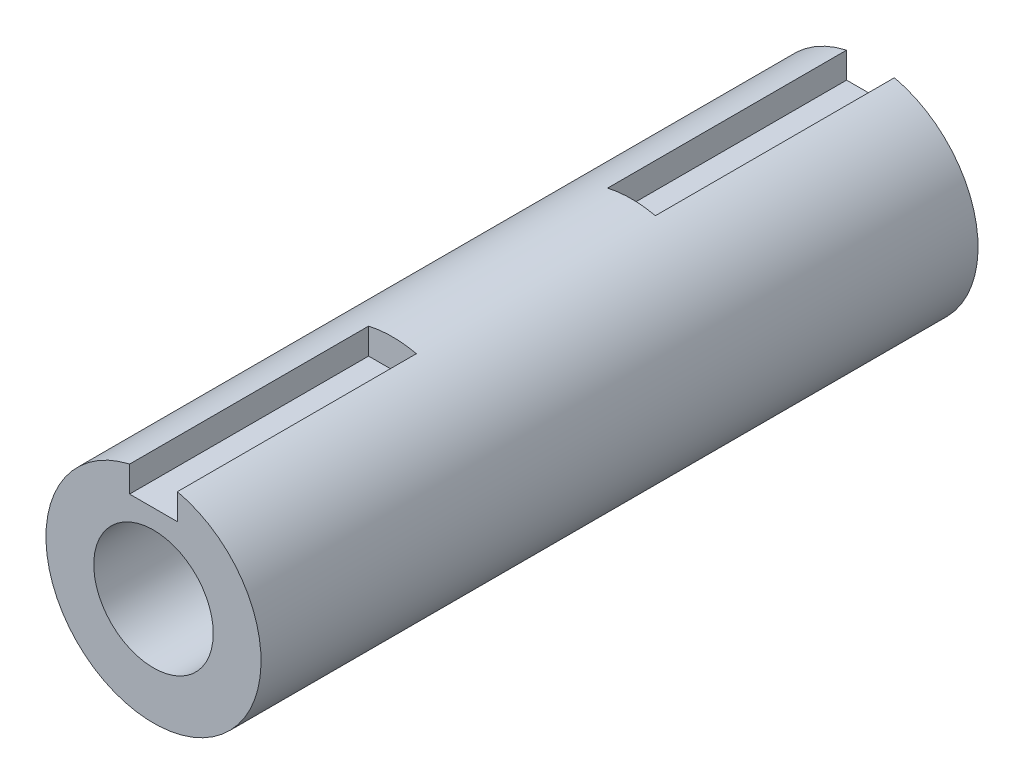
ISO-10303-21;
HEADER;
FILE_DESCRIPTION(('STEP AP214'),'2;1');
FILE_NAME('part.step','',(''),(''),'','','');
FILE_SCHEMA(('AUTOMOTIVE_DESIGN { 1 0 10303 214 1 1 1 1 }'));
ENDSEC;
DATA;
#1=APPLICATION_CONTEXT('core data for automotive mechanical design processes');
#2=APPLICATION_PROTOCOL_DEFINITION('international standard','automotive_design',2000,#1);
#3=PRODUCT_CONTEXT('',#1,'mechanical');
#4=PRODUCT('Part','Part','',(#3));
#5=PRODUCT_RELATED_PRODUCT_CATEGORY('part','',(#4));
#6=PRODUCT_DEFINITION_FORMATION('','',#4);
#7=PRODUCT_DEFINITION_CONTEXT('part definition',#1,'design');
#8=PRODUCT_DEFINITION('design','',#6,#7);
#9=PRODUCT_DEFINITION_SHAPE('','',#8);
#10=(LENGTH_UNIT() NAMED_UNIT(*) SI_UNIT(.MILLI.,.METRE.));
#11=(NAMED_UNIT(*) PLANE_ANGLE_UNIT() SI_UNIT($,.RADIAN.));
#12=(NAMED_UNIT(*) SI_UNIT($,.STERADIAN.) SOLID_ANGLE_UNIT());
#13=UNCERTAINTY_MEASURE_WITH_UNIT(LENGTH_MEASURE(1.E-05),#10,'distance_accuracy_value','');
#14=(GEOMETRIC_REPRESENTATION_CONTEXT(3) GLOBAL_UNCERTAINTY_ASSIGNED_CONTEXT((#13)) GLOBAL_UNIT_ASSIGNED_CONTEXT((#10,
#11,#12)) REPRESENTATION_CONTEXT('',''));
#15=CARTESIAN_POINT('',(0.,0.,0.));
#16=DIRECTION('',(0.,0.,1.));
#17=DIRECTION('',(1.,0.,0.));
#18=AXIS2_PLACEMENT_3D('',#15,#16,#17);
#19=CARTESIAN_POINT('',(0.,0.,-75.));
#20=DIRECTION('',(0.,0.,1.));
#21=DIRECTION('',(1.,0.,0.));
#22=AXIS2_PLACEMENT_3D('',#19,#20,#21);
#23=PLANE('',#22);
#24=CARTESIAN_POINT('',(0.,0.,-75.));
#25=DIRECTION('',(0.,0.,1.));
#26=DIRECTION('',(1.,0.,0.));
#27=AXIS2_PLACEMENT_3D('',#24,#25,#26);
#28=CIRCLE('',#27,12.5);
#29=CARTESIAN_POINT('',(12.5,0.,-75.));
#30=VERTEX_POINT('',#29);
#31=EDGE_CURVE('E143',#30,#30,#28,.T.);
#32=ORIENTED_EDGE('',*,*,#31,.T.);
#33=EDGE_LOOP('',(#32));
#34=FACE_BOUND('',#33,.T.);
#35=DIRECTION('',(0.,-1.,0.));
#36=VECTOR('',#35,1.);
#37=CARTESIAN_POINT('',(-5.,35.9248245413178,-75.));
#38=LINE('',#37,#36);
#39=CARTESIAN_POINT('',(-5.,21.9374109684803,-75.));
#40=VERTEX_POINT('',#39);
#41=CARTESIAN_POINT('',(-5.,16.5,-75.));
#42=VERTEX_POINT('',#41);
#43=EDGE_CURVE('E122',#40,#42,#38,.T.);
#44=ORIENTED_EDGE('',*,*,#43,.T.);
#45=DIRECTION('',(1.,0.,0.));
#46=VECTOR('',#45,1.);
#47=CARTESIAN_POINT('',(-5.,16.5,-75.));
#48=LINE('',#47,#46);
#49=CARTESIAN_POINT('',(5.,16.5,-75.));
#50=VERTEX_POINT('',#49);
#51=EDGE_CURVE('E119',#42,#50,#48,.T.);
#52=ORIENTED_EDGE('',*,*,#51,.T.);
#53=DIRECTION('',(0.,1.,0.));
#54=VECTOR('',#53,1.);
#55=CARTESIAN_POINT('',(5.,35.9248245413178,-75.));
#56=LINE('',#55,#54);
#57=CARTESIAN_POINT('',(5.,21.9374109684803,-75.));
#58=VERTEX_POINT('',#57);
#59=EDGE_CURVE('E112',#50,#58,#56,.T.);
#60=ORIENTED_EDGE('',*,*,#59,.T.);
#61=CARTESIAN_POINT('',(0.,0.,-75.));
#62=DIRECTION('',(0.,0.,1.));
#63=DIRECTION('',(1.,0.,0.));
#64=AXIS2_PLACEMENT_3D('',#61,#62,#63);
#65=CIRCLE('',#64,22.5);
#66=EDGE_CURVE('E149',#40,#58,#65,.T.);
#67=ORIENTED_EDGE('',*,*,#66,.F.);
#68=EDGE_LOOP('',(#44,#52,#60,#67));
#69=FACE_BOUND('',#68,.T.);
#70=ADVANCED_FACE('F33',(#34,#69),#23,.F.);
#71=CARTESIAN_POINT('',(0.,0.,75.));
#72=DIRECTION('',(0.,0.,-1.));
#73=DIRECTION('',(-1.,0.,0.));
#74=AXIS2_PLACEMENT_3D('',#71,#72,#73);
#75=CYLINDRICAL_SURFACE('',#74,22.5);
#76=CARTESIAN_POINT('',(0.,0.,75.));
#77=DIRECTION('',(0.,0.,1.));
#78=DIRECTION('',(1.,0.,0.));
#79=AXIS2_PLACEMENT_3D('',#76,#77,#78);
#80=CIRCLE('',#79,22.5);
#81=CARTESIAN_POINT('',(-5.,21.9374109684803,75.));
#82=VERTEX_POINT('',#81);
#83=CARTESIAN_POINT('',(5.,21.9374109684803,75.));
#84=VERTEX_POINT('',#83);
#85=EDGE_CURVE('E152',#82,#84,#80,.T.);
#86=ORIENTED_EDGE('',*,*,#85,.F.);
#87=DIRECTION('',(0.,0.,-1.));
#88=VECTOR('',#87,1.);
#89=CARTESIAN_POINT('',(-5.,21.9374109684803,75.));
#90=LINE('',#89,#88);
#91=CARTESIAN_POINT('',(-5.,21.9374109684803,25.));
#92=VERTEX_POINT('',#91);
#93=EDGE_CURVE('E162',#82,#92,#90,.T.);
#94=ORIENTED_EDGE('',*,*,#93,.T.);
#95=CARTESIAN_POINT('',(0.,0.,25.));
#96=DIRECTION('',(0.,0.,1.));
#97=DIRECTION('',(1.,0.,0.));
#98=AXIS2_PLACEMENT_3D('',#95,#96,#97);
#99=CIRCLE('',#98,22.5);
#100=CARTESIAN_POINT('',(5.,21.9374109684803,25.));
#101=VERTEX_POINT('',#100);
#102=EDGE_CURVE('E155',#101,#92,#99,.T.);
#103=ORIENTED_EDGE('',*,*,#102,.F.);
#104=DIRECTION('',(0.,0.,-1.));
#105=VECTOR('',#104,1.);
#106=CARTESIAN_POINT('',(5.,21.9374109684803,75.));
#107=LINE('',#106,#105);
#108=EDGE_CURVE('E159',#101,#84,#107,.F.);
#109=ORIENTED_EDGE('',*,*,#108,.T.);
#110=EDGE_LOOP('',(#86,#94,#103,#109));
#111=FACE_BOUND('',#110,.T.);
#112=DIRECTION('',(0.,0.,-1.));
#113=VECTOR('',#112,1.);
#114=CARTESIAN_POINT('',(-5.,21.9374109684803,75.));
#115=LINE('',#114,#113);
#116=CARTESIAN_POINT('',(-5.,21.9374109684803,-25.));
#117=VERTEX_POINT('',#116);
#118=EDGE_CURVE('E11',#40,#117,#115,.F.);
#119=ORIENTED_EDGE('',*,*,#118,.F.);
#120=ORIENTED_EDGE('',*,*,#66,.T.);
#121=DIRECTION('',(0.,0.,-1.));
#122=VECTOR('',#121,1.);
#123=CARTESIAN_POINT('',(5.,21.9374109684803,75.));
#124=LINE('',#123,#122);
#125=CARTESIAN_POINT('',(5.,21.9374109684803,-25.));
#126=VERTEX_POINT('',#125);
#127=EDGE_CURVE('E41',#126,#58,#124,.T.);
#128=ORIENTED_EDGE('',*,*,#127,.F.);
#129=CARTESIAN_POINT('',(0.,0.,-25.));
#130=DIRECTION('',(0.,0.,-1.));
#131=DIRECTION('',(-1.,0.,0.));
#132=AXIS2_PLACEMENT_3D('',#129,#130,#131);
#133=CIRCLE('',#132,22.5);
#134=EDGE_CURVE('E117',#117,#126,#133,.T.);
#135=ORIENTED_EDGE('',*,*,#134,.F.);
#136=EDGE_LOOP('',(#119,#120,#128,#135));
#137=FACE_BOUND('',#136,.T.);
#138=ADVANCED_FACE('F35',(#111,#137),#75,.T.);
#139=CARTESIAN_POINT('',(0.,0.,75.));
#140=DIRECTION('',(0.,0.,1.));
#141=DIRECTION('',(1.,0.,0.));
#142=AXIS2_PLACEMENT_3D('',#139,#140,#141);
#143=PLANE('',#142);
#144=DIRECTION('',(0.,-1.,0.));
#145=VECTOR('',#144,1.);
#146=CARTESIAN_POINT('',(-5.,35.9248245413178,75.));
#147=LINE('',#146,#145);
#148=CARTESIAN_POINT('',(-5.,16.5,75.));
#149=VERTEX_POINT('',#148);
#150=EDGE_CURVE('E127',#82,#149,#147,.T.);
#151=ORIENTED_EDGE('',*,*,#150,.F.);
#152=ORIENTED_EDGE('',*,*,#85,.T.);
#153=DIRECTION('',(0.,1.,0.));
#154=VECTOR('',#153,1.);
#155=CARTESIAN_POINT('',(5.,35.9248245413178,75.));
#156=LINE('',#155,#154);
#157=CARTESIAN_POINT('',(5.,16.5,75.));
#158=VERTEX_POINT('',#157);
#159=EDGE_CURVE('E132',#158,#84,#156,.T.);
#160=ORIENTED_EDGE('',*,*,#159,.F.);
#161=DIRECTION('',(1.,0.,0.));
#162=VECTOR('',#161,1.);
#163=CARTESIAN_POINT('',(-5.,16.5,75.));
#164=LINE('',#163,#162);
#165=EDGE_CURVE('E137',#149,#158,#164,.T.);
#166=ORIENTED_EDGE('',*,*,#165,.F.);
#167=EDGE_LOOP('',(#151,#152,#160,#166));
#168=FACE_BOUND('',#167,.T.);
#169=CARTESIAN_POINT('',(0.,0.,75.));
#170=DIRECTION('',(0.,0.,1.));
#171=DIRECTION('',(1.,0.,0.));
#172=AXIS2_PLACEMENT_3D('',#169,#170,#171);
#173=CIRCLE('',#172,12.5);
#174=CARTESIAN_POINT('',(12.5,0.,75.));
#175=VERTEX_POINT('',#174);
#176=EDGE_CURVE('E146',#175,#175,#173,.T.);
#177=ORIENTED_EDGE('',*,*,#176,.F.);
#178=EDGE_LOOP('',(#177));
#179=FACE_BOUND('',#178,.T.);
#180=ADVANCED_FACE('F188',(#168,#179),#143,.T.);
#181=CARTESIAN_POINT('',(0.,0.,75.));
#182=DIRECTION('',(0.,0.,-1.));
#183=DIRECTION('',(-1.,0.,0.));
#184=AXIS2_PLACEMENT_3D('',#181,#182,#183);
#185=CYLINDRICAL_SURFACE('',#184,12.5);
#186=ORIENTED_EDGE('',*,*,#176,.T.);
#187=EDGE_LOOP('',(#186));
#188=FACE_BOUND('',#187,.T.);
#189=ORIENTED_EDGE('',*,*,#31,.F.);
#190=EDGE_LOOP('',(#189));
#191=FACE_BOUND('',#190,.T.);
#192=ADVANCED_FACE('F193',(#188,#191),#185,.F.);
#193=CARTESIAN_POINT('',(-5.,35.9248245413178,25.));
#194=DIRECTION('',(-1.,0.,0.));
#195=DIRECTION('',(0.,-1.,0.));
#196=AXIS2_PLACEMENT_3D('',#193,#194,#195);
#197=PLANE('',#196);
#198=ORIENTED_EDGE('',*,*,#150,.T.);
#199=DIRECTION('',(0.,0.,1.));
#200=VECTOR('',#199,1.);
#201=CARTESIAN_POINT('',(-5.,16.5,25.));
#202=LINE('',#201,#200);
#203=CARTESIAN_POINT('',(-5.,16.5,25.));
#204=VERTEX_POINT('',#203);
#205=EDGE_CURVE('E135',#204,#149,#202,.T.);
#206=ORIENTED_EDGE('',*,*,#205,.F.);
#207=DIRECTION('',(0.,-1.,0.));
#208=VECTOR('',#207,1.);
#209=CARTESIAN_POINT('',(-5.,35.9248245413178,25.));
#210=LINE('',#209,#208);
#211=EDGE_CURVE('E129',#92,#204,#210,.T.);
#212=ORIENTED_EDGE('',*,*,#211,.F.);
#213=ORIENTED_EDGE('',*,*,#93,.F.);
#214=EDGE_LOOP('',(#198,#206,#212,#213));
#215=FACE_BOUND('',#214,.T.);
#216=ADVANCED_FACE('F197',(#215),#197,.F.);
#217=CARTESIAN_POINT('',(5.,35.9248245413178,25.));
#218=DIRECTION('',(1.,0.,0.));
#219=DIRECTION('',(0.,1.,0.));
#220=AXIS2_PLACEMENT_3D('',#217,#218,#219);
#221=PLANE('',#220);
#222=DIRECTION('',(0.,1.,0.));
#223=VECTOR('',#222,1.);
#224=CARTESIAN_POINT('',(5.,35.9248245413178,25.));
#225=LINE('',#224,#223);
#226=CARTESIAN_POINT('',(5.,16.5,25.));
#227=VERTEX_POINT('',#226);
#228=EDGE_CURVE('E55',#227,#101,#225,.T.);
#229=ORIENTED_EDGE('',*,*,#228,.F.);
#230=DIRECTION('',(0.,0.,1.));
#231=VECTOR('',#230,1.);
#232=CARTESIAN_POINT('',(5.,16.5,25.));
#233=LINE('',#232,#231);
#234=EDGE_CURVE('E141',#227,#158,#233,.T.);
#235=ORIENTED_EDGE('',*,*,#234,.T.);
#236=ORIENTED_EDGE('',*,*,#159,.T.);
#237=ORIENTED_EDGE('',*,*,#108,.F.);
#238=EDGE_LOOP('',(#229,#235,#236,#237));
#239=FACE_BOUND('',#238,.T.);
#240=ADVANCED_FACE('F200',(#239),#221,.F.);
#241=CARTESIAN_POINT('',(0.,0.,25.));
#242=DIRECTION('',(0.,0.,1.));
#243=DIRECTION('',(1.,0.,0.));
#244=AXIS2_PLACEMENT_3D('',#241,#242,#243);
#245=PLANE('',#244);
#246=ORIENTED_EDGE('',*,*,#102,.T.);
#247=ORIENTED_EDGE('',*,*,#211,.T.);
#248=DIRECTION('',(1.,0.,0.));
#249=VECTOR('',#248,1.);
#250=CARTESIAN_POINT('',(-5.,16.5,25.));
#251=LINE('',#250,#249);
#252=EDGE_CURVE('E131',#204,#227,#251,.T.);
#253=ORIENTED_EDGE('',*,*,#252,.T.);
#254=ORIENTED_EDGE('',*,*,#228,.T.);
#255=EDGE_LOOP('',(#246,#247,#253,#254));
#256=FACE_BOUND('',#255,.T.);
#257=ADVANCED_FACE('F179',(#256),#245,.T.);
#258=CARTESIAN_POINT('',(-5.,16.5,25.));
#259=DIRECTION('',(0.,-1.,0.));
#260=DIRECTION('',(0.,0.,-1.));
#261=AXIS2_PLACEMENT_3D('',#258,#259,#260);
#262=PLANE('',#261);
#263=ORIENTED_EDGE('',*,*,#165,.T.);
#264=ORIENTED_EDGE('',*,*,#234,.F.);
#265=ORIENTED_EDGE('',*,*,#252,.F.);
#266=ORIENTED_EDGE('',*,*,#205,.T.);
#267=EDGE_LOOP('',(#263,#264,#265,#266));
#268=FACE_BOUND('',#267,.T.);
#269=ADVANCED_FACE('F172',(#268),#262,.F.);
#270=CARTESIAN_POINT('',(-5.,35.9248245413178,-25.));
#271=DIRECTION('',(1.,0.,0.));
#272=DIRECTION('',(0.,1.,0.));
#273=AXIS2_PLACEMENT_3D('',#270,#271,#272);
#274=PLANE('',#273);
#275=ORIENTED_EDGE('',*,*,#118,.T.);
#276=DIRECTION('',(0.,-1.,0.));
#277=VECTOR('',#276,1.);
#278=CARTESIAN_POINT('',(-5.,35.9248245413178,-25.));
#279=LINE('',#278,#277);
#280=CARTESIAN_POINT('',(-5.,16.5,-25.));
#281=VERTEX_POINT('',#280);
#282=EDGE_CURVE('E48',#117,#281,#279,.T.);
#283=ORIENTED_EDGE('',*,*,#282,.T.);
#284=DIRECTION('',(0.,0.,-1.));
#285=VECTOR('',#284,1.);
#286=CARTESIAN_POINT('',(-5.,16.5,-25.));
#287=LINE('',#286,#285);
#288=EDGE_CURVE('E103',#281,#42,#287,.T.);
#289=ORIENTED_EDGE('',*,*,#288,.T.);
#290=ORIENTED_EDGE('',*,*,#43,.F.);
#291=EDGE_LOOP('',(#275,#283,#289,#290));
#292=FACE_BOUND('',#291,.T.);
#293=ADVANCED_FACE('F170',(#292),#274,.T.);
#294=CARTESIAN_POINT('',(5.,35.9248245413178,-25.));
#295=DIRECTION('',(-1.,0.,0.));
#296=DIRECTION('',(0.,-1.,0.));
#297=AXIS2_PLACEMENT_3D('',#294,#295,#296);
#298=PLANE('',#297);
#299=ORIENTED_EDGE('',*,*,#127,.T.);
#300=ORIENTED_EDGE('',*,*,#59,.F.);
#301=DIRECTION('',(0.,0.,-1.));
#302=VECTOR('',#301,1.);
#303=CARTESIAN_POINT('',(5.,16.5,-25.));
#304=LINE('',#303,#302);
#305=CARTESIAN_POINT('',(5.,16.5,-25.));
#306=VERTEX_POINT('',#305);
#307=EDGE_CURVE('E100',#306,#50,#304,.T.);
#308=ORIENTED_EDGE('',*,*,#307,.F.);
#309=DIRECTION('',(0.,1.,0.));
#310=VECTOR('',#309,1.);
#311=CARTESIAN_POINT('',(5.,35.9248245413178,-25.));
#312=LINE('',#311,#310);
#313=EDGE_CURVE('E105',#306,#126,#312,.T.);
#314=ORIENTED_EDGE('',*,*,#313,.T.);
#315=EDGE_LOOP('',(#299,#300,#308,#314));
#316=FACE_BOUND('',#315,.T.);
#317=ADVANCED_FACE('F109',(#316),#298,.T.);
#318=CARTESIAN_POINT('',(0.,0.,-25.));
#319=DIRECTION('',(0.,0.,-1.));
#320=DIRECTION('',(1.,0.,0.));
#321=AXIS2_PLACEMENT_3D('',#318,#319,#320);
#322=PLANE('',#321);
#323=ORIENTED_EDGE('',*,*,#134,.T.);
#324=ORIENTED_EDGE('',*,*,#313,.F.);
#325=DIRECTION('',(1.,0.,0.));
#326=VECTOR('',#325,1.);
#327=CARTESIAN_POINT('',(-5.,16.5,-25.));
#328=LINE('',#327,#326);
#329=EDGE_CURVE('E97',#281,#306,#328,.T.);
#330=ORIENTED_EDGE('',*,*,#329,.F.);
#331=ORIENTED_EDGE('',*,*,#282,.F.);
#332=EDGE_LOOP('',(#323,#324,#330,#331));
#333=FACE_BOUND('',#332,.T.);
#334=ADVANCED_FACE('F115',(#333),#322,.T.);
#335=CARTESIAN_POINT('',(-5.,16.5,-25.));
#336=DIRECTION('',(0.,1.,0.));
#337=DIRECTION('',(0.,0.,1.));
#338=AXIS2_PLACEMENT_3D('',#335,#336,#337);
#339=PLANE('',#338);
#340=ORIENTED_EDGE('',*,*,#51,.F.);
#341=ORIENTED_EDGE('',*,*,#288,.F.);
#342=ORIENTED_EDGE('',*,*,#329,.T.);
#343=ORIENTED_EDGE('',*,*,#307,.T.);
#344=EDGE_LOOP('',(#340,#341,#342,#343));
#345=FACE_BOUND('',#344,.T.);
#346=ADVANCED_FACE('F99',(#345),#339,.T.);
#347=CLOSED_SHELL('',(#70,#138,#180,#192,#216,#240,#257,#269,#293,#317,#334,#346));
#348=MANIFOLD_SOLID_BREP('B2',#347);
#349=ADVANCED_BREP_SHAPE_REPRESENTATION('',(#18,#348),#14);
#350=SHAPE_DEFINITION_REPRESENTATION(#9,#349);
ENDSEC;
END-ISO-10303-21;
